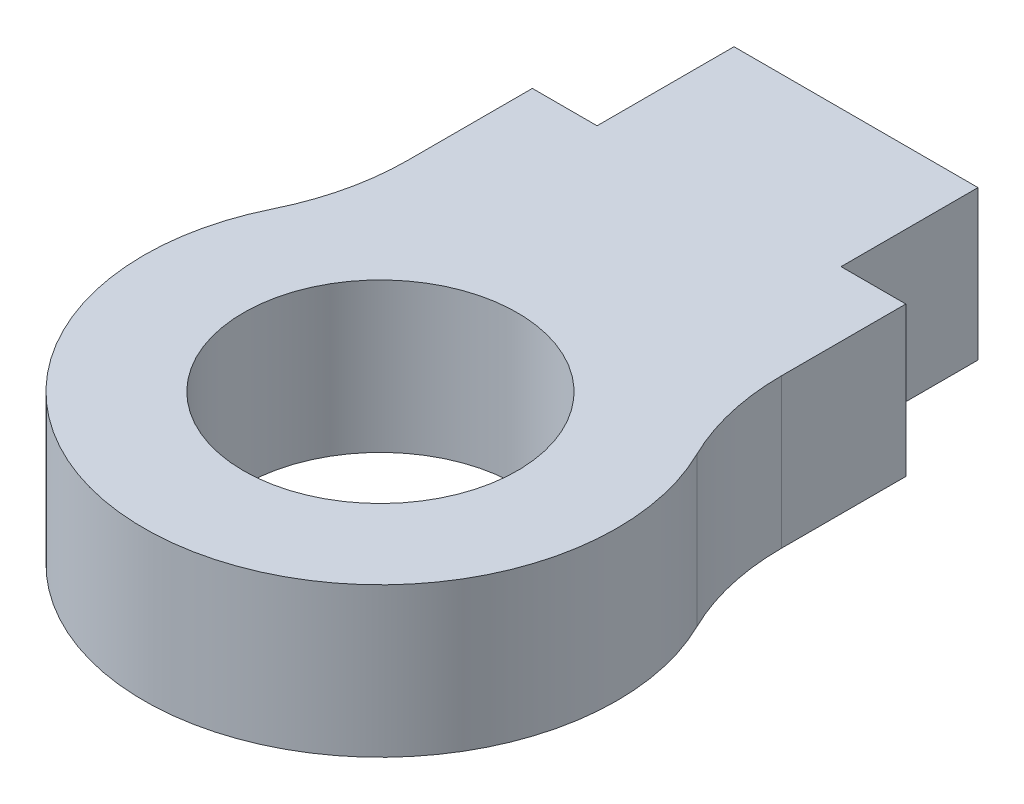
ISO-10303-21;
HEADER;
FILE_DESCRIPTION(('STEP AP214'),'2;1');
FILE_NAME('part.step','',(''),(''),'','','');
FILE_SCHEMA(('AUTOMOTIVE_DESIGN { 1 0 10303 214 1 1 1 1 }'));
ENDSEC;
DATA;
#1=APPLICATION_CONTEXT('core data for automotive mechanical design processes');
#2=APPLICATION_PROTOCOL_DEFINITION('international standard','automotive_design',2000,#1);
#3=PRODUCT_CONTEXT('',#1,'mechanical');
#4=PRODUCT('Part','Part','',(#3));
#5=PRODUCT_RELATED_PRODUCT_CATEGORY('part','',(#4));
#6=PRODUCT_DEFINITION_FORMATION('','',#4);
#7=PRODUCT_DEFINITION_CONTEXT('part definition',#1,'design');
#8=PRODUCT_DEFINITION('design','',#6,#7);
#9=PRODUCT_DEFINITION_SHAPE('','',#8);
#10=(LENGTH_UNIT() NAMED_UNIT(*) SI_UNIT(.MILLI.,.METRE.));
#11=(NAMED_UNIT(*) PLANE_ANGLE_UNIT() SI_UNIT($,.RADIAN.));
#12=(NAMED_UNIT(*) SI_UNIT($,.STERADIAN.) SOLID_ANGLE_UNIT());
#13=UNCERTAINTY_MEASURE_WITH_UNIT(LENGTH_MEASURE(1.E-05),#10,'distance_accuracy_value','');
#14=(GEOMETRIC_REPRESENTATION_CONTEXT(3) GLOBAL_UNCERTAINTY_ASSIGNED_CONTEXT((#13)) GLOBAL_UNIT_ASSIGNED_CONTEXT((#10,
#11,#12)) REPRESENTATION_CONTEXT('',''));
#15=CARTESIAN_POINT('',(0.,0.,0.));
#16=DIRECTION('',(0.,0.,1.));
#17=DIRECTION('',(1.,0.,0.));
#18=AXIS2_PLACEMENT_3D('',#15,#16,#17);
#19=CARTESIAN_POINT('',(-17.5,6.,-8.60232526704262));
#20=DIRECTION('',(0.,1.,0.));
#21=DIRECTION('',(0.,0.,1.));
#22=AXIS2_PLACEMENT_3D('',#19,#20,#21);
#23=PLANE('',#22);
#24=CARTESIAN_POINT('',(-17.5,6.,-8.60232526704262));
#25=DIRECTION('',(0.,-1.,0.));
#26=DIRECTION('',(0.,0.,1.));
#27=AXIS2_PLACEMENT_3D('',#24,#25,#26);
#28=CIRCLE('',#27,10.);
#29=CARTESIAN_POINT('',(-7.5,6.,-8.60232526704262));
#30=VERTEX_POINT('',#29);
#31=CARTESIAN_POINT('',(-8.52564102564102,6.,-4.19087641214897));
#32=VERTEX_POINT('',#31);
#33=EDGE_CURVE('E160',#30,#32,#28,.T.);
#34=ORIENTED_EDGE('',*,*,#33,.T.);
#35=CARTESIAN_POINT('',(0.,6.,0.));
#36=DIRECTION('',(0.,1.,0.));
#37=DIRECTION('',(0.,0.,1.));
#38=AXIS2_PLACEMENT_3D('',#35,#36,#37);
#39=CIRCLE('',#38,9.5);
#40=CARTESIAN_POINT('',(8.52564102564102,6.,-4.19087641214897));
#41=VERTEX_POINT('',#40);
#42=EDGE_CURVE('E98',#32,#41,#39,.T.);
#43=ORIENTED_EDGE('',*,*,#42,.T.);
#44=CARTESIAN_POINT('',(17.5,6.,-8.60232526704262));
#45=DIRECTION('',(0.,-1.,0.));
#46=DIRECTION('',(0.,0.,1.));
#47=AXIS2_PLACEMENT_3D('',#44,#45,#46);
#48=CIRCLE('',#47,10.);
#49=CARTESIAN_POINT('',(7.5,6.,-8.60232526704262));
#50=VERTEX_POINT('',#49);
#51=EDGE_CURVE('E181',#41,#50,#48,.T.);
#52=ORIENTED_EDGE('',*,*,#51,.T.);
#53=DIRECTION('',(0.,0.,-1.));
#54=VECTOR('',#53,1.);
#55=CARTESIAN_POINT('',(7.5,6.,-8.60232526704262));
#56=LINE('',#55,#54);
#57=CARTESIAN_POINT('',(7.5,6.,-13.6023252670426));
#58=VERTEX_POINT('',#57);
#59=EDGE_CURVE('E200',#50,#58,#56,.T.);
#60=ORIENTED_EDGE('',*,*,#59,.T.);
#61=DIRECTION('',(-1.,0.,0.));
#62=VECTOR('',#61,1.);
#63=CARTESIAN_POINT('',(7.5,6.,-13.6023252670426));
#64=LINE('',#63,#62);
#65=CARTESIAN_POINT('',(4.9,6.,-13.6023252670426));
#66=VERTEX_POINT('',#65);
#67=EDGE_CURVE('E197',#58,#66,#64,.T.);
#68=ORIENTED_EDGE('',*,*,#67,.T.);
#69=DIRECTION('',(0.,0.,-1.));
#70=VECTOR('',#69,1.);
#71=CARTESIAN_POINT('',(4.9,6.,-13.6023252670426));
#72=LINE('',#71,#70);
#73=CARTESIAN_POINT('',(4.9,6.,-19.1023252670426));
#74=VERTEX_POINT('',#73);
#75=EDGE_CURVE('E199',#66,#74,#72,.T.);
#76=ORIENTED_EDGE('',*,*,#75,.T.);
#77=DIRECTION('',(-1.,0.,0.));
#78=VECTOR('',#77,1.);
#79=CARTESIAN_POINT('',(4.9,6.,-19.1023252670426));
#80=LINE('',#79,#78);
#81=CARTESIAN_POINT('',(-4.9,6.,-19.1023252670426));
#82=VERTEX_POINT('',#81);
#83=EDGE_CURVE('E123',#74,#82,#80,.T.);
#84=ORIENTED_EDGE('',*,*,#83,.T.);
#85=DIRECTION('',(0.,0.,1.));
#86=VECTOR('',#85,1.);
#87=CARTESIAN_POINT('',(-4.9,6.,-19.1023252670426));
#88=LINE('',#87,#86);
#89=CARTESIAN_POINT('',(-4.9,6.,-13.6023252670426));
#90=VERTEX_POINT('',#89);
#91=EDGE_CURVE('E117',#82,#90,#88,.T.);
#92=ORIENTED_EDGE('',*,*,#91,.T.);
#93=DIRECTION('',(-1.,0.,0.));
#94=VECTOR('',#93,1.);
#95=CARTESIAN_POINT('',(-4.9,6.,-13.6023252670426));
#96=LINE('',#95,#94);
#97=CARTESIAN_POINT('',(-7.5,6.,-13.6023252670426));
#98=VERTEX_POINT('',#97);
#99=EDGE_CURVE('E121',#90,#98,#96,.T.);
#100=ORIENTED_EDGE('',*,*,#99,.T.);
#101=DIRECTION('',(0.,0.,1.));
#102=VECTOR('',#101,1.);
#103=CARTESIAN_POINT('',(-7.5,6.,-13.6023252670426));
#104=LINE('',#103,#102);
#105=EDGE_CURVE('E49',#98,#30,#104,.T.);
#106=ORIENTED_EDGE('',*,*,#105,.T.);
#107=EDGE_LOOP('',(#34,#43,#52,#60,#68,#76,#84,#92,#100,#106));
#108=FACE_BOUND('',#107,.T.);
#109=CARTESIAN_POINT('',(0.,6.,0.));
#110=DIRECTION('',(0.,1.,0.));
#111=DIRECTION('',(0.,0.,1.));
#112=AXIS2_PLACEMENT_3D('',#109,#110,#111);
#113=CIRCLE('',#112,5.5);
#114=CARTESIAN_POINT('',(0.,6.,5.5));
#115=VERTEX_POINT('',#114);
#116=EDGE_CURVE('E145',#115,#115,#113,.T.);
#117=ORIENTED_EDGE('',*,*,#116,.F.);
#118=EDGE_LOOP('',(#117));
#119=FACE_BOUND('',#118,.T.);
#120=ADVANCED_FACE('F32',(#108,#119),#23,.T.);
#121=CARTESIAN_POINT('',(-17.5,0.,-8.60232526704262));
#122=DIRECTION('',(0.,1.,0.));
#123=DIRECTION('',(0.,0.,1.));
#124=AXIS2_PLACEMENT_3D('',#121,#122,#123);
#125=PLANE('',#124);
#126=CARTESIAN_POINT('',(-17.5,0.,-8.60232526704262));
#127=DIRECTION('',(0.,-1.,0.));
#128=DIRECTION('',(0.,0.,1.));
#129=AXIS2_PLACEMENT_3D('',#126,#127,#128);
#130=CIRCLE('',#129,10.);
#131=CARTESIAN_POINT('',(-7.5,0.,-8.60232526704262));
#132=VERTEX_POINT('',#131);
#133=CARTESIAN_POINT('',(-8.52564102564102,0.,-4.19087641214897));
#134=VERTEX_POINT('',#133);
#135=EDGE_CURVE('E141',#132,#134,#130,.T.);
#136=ORIENTED_EDGE('',*,*,#135,.F.);
#137=DIRECTION('',(0.,0.,1.));
#138=VECTOR('',#137,1.);
#139=CARTESIAN_POINT('',(-7.5,0.,-13.6023252670426));
#140=LINE('',#139,#138);
#141=CARTESIAN_POINT('',(-7.5,0.,-13.6023252670426));
#142=VERTEX_POINT('',#141);
#143=EDGE_CURVE('E90',#142,#132,#140,.T.);
#144=ORIENTED_EDGE('',*,*,#143,.F.);
#145=DIRECTION('',(-1.,0.,0.));
#146=VECTOR('',#145,1.);
#147=CARTESIAN_POINT('',(-4.9,0.,-13.6023252670426));
#148=LINE('',#147,#146);
#149=CARTESIAN_POINT('',(-4.9,0.,-13.6023252670426));
#150=VERTEX_POINT('',#149);
#151=EDGE_CURVE('E84',#150,#142,#148,.T.);
#152=ORIENTED_EDGE('',*,*,#151,.F.);
#153=DIRECTION('',(0.,0.,1.));
#154=VECTOR('',#153,1.);
#155=CARTESIAN_POINT('',(-4.9,0.,-19.1023252670426));
#156=LINE('',#155,#154);
#157=CARTESIAN_POINT('',(-4.9,0.,-19.1023252670426));
#158=VERTEX_POINT('',#157);
#159=EDGE_CURVE('E131',#158,#150,#156,.T.);
#160=ORIENTED_EDGE('',*,*,#159,.F.);
#161=DIRECTION('',(-1.,0.,0.));
#162=VECTOR('',#161,1.);
#163=CARTESIAN_POINT('',(4.9,0.,-19.1023252670426));
#164=LINE('',#163,#162);
#165=CARTESIAN_POINT('',(4.9,0.,-19.1023252670426));
#166=VERTEX_POINT('',#165);
#167=EDGE_CURVE('E155',#166,#158,#164,.T.);
#168=ORIENTED_EDGE('',*,*,#167,.F.);
#169=DIRECTION('',(0.,0.,-1.));
#170=VECTOR('',#169,1.);
#171=CARTESIAN_POINT('',(4.9,0.,-13.6023252670426));
#172=LINE('',#171,#170);
#173=CARTESIAN_POINT('',(4.9,0.,-13.6023252670426));
#174=VERTEX_POINT('',#173);
#175=EDGE_CURVE('E153',#174,#166,#172,.T.);
#176=ORIENTED_EDGE('',*,*,#175,.F.);
#177=DIRECTION('',(-1.,0.,0.));
#178=VECTOR('',#177,1.);
#179=CARTESIAN_POINT('',(7.5,0.,-13.6023252670426));
#180=LINE('',#179,#178);
#181=CARTESIAN_POINT('',(7.5,0.,-13.6023252670426));
#182=VERTEX_POINT('',#181);
#183=EDGE_CURVE('E151',#182,#174,#180,.T.);
#184=ORIENTED_EDGE('',*,*,#183,.F.);
#185=DIRECTION('',(0.,0.,-1.));
#186=VECTOR('',#185,1.);
#187=CARTESIAN_POINT('',(7.5,0.,-8.60232526704262));
#188=LINE('',#187,#186);
#189=CARTESIAN_POINT('',(7.5,0.,-8.60232526704262));
#190=VERTEX_POINT('',#189);
#191=EDGE_CURVE('E149',#190,#182,#188,.T.);
#192=ORIENTED_EDGE('',*,*,#191,.F.);
#193=CARTESIAN_POINT('',(17.5,0.,-8.60232526704262));
#194=DIRECTION('',(0.,-1.,0.));
#195=DIRECTION('',(0.,0.,1.));
#196=AXIS2_PLACEMENT_3D('',#193,#194,#195);
#197=CIRCLE('',#196,10.);
#198=CARTESIAN_POINT('',(8.52564102564102,0.,-4.19087641214897));
#199=VERTEX_POINT('',#198);
#200=EDGE_CURVE('E147',#199,#190,#197,.T.);
#201=ORIENTED_EDGE('',*,*,#200,.F.);
#202=CARTESIAN_POINT('',(0.,0.,0.));
#203=DIRECTION('',(0.,1.,0.));
#204=DIRECTION('',(0.,0.,1.));
#205=AXIS2_PLACEMENT_3D('',#202,#203,#204);
#206=CIRCLE('',#205,9.5);
#207=EDGE_CURVE('E144',#134,#199,#206,.T.);
#208=ORIENTED_EDGE('',*,*,#207,.F.);
#209=EDGE_LOOP('',(#136,#144,#152,#160,#168,#176,#184,#192,#201,#208));
#210=FACE_BOUND('',#209,.T.);
#211=CARTESIAN_POINT('',(0.,0.,0.));
#212=DIRECTION('',(0.,1.,0.));
#213=DIRECTION('',(0.,0.,1.));
#214=AXIS2_PLACEMENT_3D('',#211,#212,#213);
#215=CIRCLE('',#214,5.5);
#216=CARTESIAN_POINT('',(0.,0.,5.5));
#217=VERTEX_POINT('',#216);
#218=EDGE_CURVE('E208',#217,#217,#215,.T.);
#219=ORIENTED_EDGE('',*,*,#218,.T.);
#220=EDGE_LOOP('',(#219));
#221=FACE_BOUND('',#220,.T.);
#222=ADVANCED_FACE('F185',(#210,#221),#125,.F.);
#223=CARTESIAN_POINT('',(-17.5,6.,-8.60232526704262));
#224=DIRECTION('',(0.,-1.,0.));
#225=DIRECTION('',(0.,0.,-1.));
#226=AXIS2_PLACEMENT_3D('',#223,#224,#225);
#227=CYLINDRICAL_SURFACE('',#226,10.);
#228=ORIENTED_EDGE('',*,*,#135,.T.);
#229=DIRECTION('',(0.,-1.,0.));
#230=VECTOR('',#229,1.);
#231=CARTESIAN_POINT('',(-8.52564102564102,6.,-4.19087641214897));
#232=LINE('',#231,#230);
#233=EDGE_CURVE('E11',#32,#134,#232,.T.);
#234=ORIENTED_EDGE('',*,*,#233,.F.);
#235=ORIENTED_EDGE('',*,*,#33,.F.);
#236=DIRECTION('',(0.,-1.,0.));
#237=VECTOR('',#236,1.);
#238=CARTESIAN_POINT('',(-7.5,6.,-8.60232526704262));
#239=LINE('',#238,#237);
#240=EDGE_CURVE('E137',#30,#132,#239,.T.);
#241=ORIENTED_EDGE('',*,*,#240,.T.);
#242=EDGE_LOOP('',(#228,#234,#235,#241));
#243=FACE_BOUND('',#242,.T.);
#244=ADVANCED_FACE('F34',(#243),#227,.F.);
#245=CARTESIAN_POINT('',(0.,6.,0.));
#246=DIRECTION('',(0.,-1.,0.));
#247=DIRECTION('',(0.,0.,-1.));
#248=AXIS2_PLACEMENT_3D('',#245,#246,#247);
#249=CYLINDRICAL_SURFACE('',#248,9.5);
#250=ORIENTED_EDGE('',*,*,#207,.T.);
#251=DIRECTION('',(0.,-1.,0.));
#252=VECTOR('',#251,1.);
#253=CARTESIAN_POINT('',(8.52564102564102,6.,-4.19087641214897));
#254=LINE('',#253,#252);
#255=EDGE_CURVE('E41',#41,#199,#254,.T.);
#256=ORIENTED_EDGE('',*,*,#255,.F.);
#257=ORIENTED_EDGE('',*,*,#42,.F.);
#258=ORIENTED_EDGE('',*,*,#233,.T.);
#259=EDGE_LOOP('',(#250,#256,#257,#258));
#260=FACE_BOUND('',#259,.T.);
#261=ADVANCED_FACE('F244',(#260),#249,.T.);
#262=CARTESIAN_POINT('',(17.5,6.,-8.60232526704262));
#263=DIRECTION('',(0.,-1.,0.));
#264=DIRECTION('',(0.,0.,-1.));
#265=AXIS2_PLACEMENT_3D('',#262,#263,#264);
#266=CYLINDRICAL_SURFACE('',#265,10.);
#267=ORIENTED_EDGE('',*,*,#200,.T.);
#268=DIRECTION('',(0.,-1.,0.));
#269=VECTOR('',#268,1.);
#270=CARTESIAN_POINT('',(7.5,6.,-8.60232526704262));
#271=LINE('',#270,#269);
#272=EDGE_CURVE('E173',#50,#190,#271,.T.);
#273=ORIENTED_EDGE('',*,*,#272,.F.);
#274=ORIENTED_EDGE('',*,*,#51,.F.);
#275=ORIENTED_EDGE('',*,*,#255,.T.);
#276=EDGE_LOOP('',(#267,#273,#274,#275));
#277=FACE_BOUND('',#276,.T.);
#278=ADVANCED_FACE('F179',(#277),#266,.F.);
#279=CARTESIAN_POINT('',(7.5,6.,-8.60232526704262));
#280=DIRECTION('',(-1.,0.,0.));
#281=DIRECTION('',(0.,0.,1.));
#282=AXIS2_PLACEMENT_3D('',#279,#280,#281);
#283=PLANE('',#282);
#284=ORIENTED_EDGE('',*,*,#191,.T.);
#285=DIRECTION('',(0.,-1.,0.));
#286=VECTOR('',#285,1.);
#287=CARTESIAN_POINT('',(7.5,6.,-13.6023252670426));
#288=LINE('',#287,#286);
#289=EDGE_CURVE('E170',#58,#182,#288,.T.);
#290=ORIENTED_EDGE('',*,*,#289,.F.);
#291=ORIENTED_EDGE('',*,*,#59,.F.);
#292=ORIENTED_EDGE('',*,*,#272,.T.);
#293=EDGE_LOOP('',(#284,#290,#291,#292));
#294=FACE_BOUND('',#293,.T.);
#295=ADVANCED_FACE('F191',(#294),#283,.F.);
#296=CARTESIAN_POINT('',(7.5,6.,-13.6023252670426));
#297=DIRECTION('',(0.,0.,1.));
#298=DIRECTION('',(1.,0.,0.));
#299=AXIS2_PLACEMENT_3D('',#296,#297,#298);
#300=PLANE('',#299);
#301=ORIENTED_EDGE('',*,*,#183,.T.);
#302=DIRECTION('',(0.,-1.,0.));
#303=VECTOR('',#302,1.);
#304=CARTESIAN_POINT('',(4.9,6.,-13.6023252670426));
#305=LINE('',#304,#303);
#306=EDGE_CURVE('E167',#66,#174,#305,.T.);
#307=ORIENTED_EDGE('',*,*,#306,.F.);
#308=ORIENTED_EDGE('',*,*,#67,.F.);
#309=ORIENTED_EDGE('',*,*,#289,.T.);
#310=EDGE_LOOP('',(#301,#307,#308,#309));
#311=FACE_BOUND('',#310,.T.);
#312=ADVANCED_FACE('F195',(#311),#300,.F.);
#313=CARTESIAN_POINT('',(4.9,6.,-13.6023252670426));
#314=DIRECTION('',(-1.,0.,0.));
#315=DIRECTION('',(0.,0.,1.));
#316=AXIS2_PLACEMENT_3D('',#313,#314,#315);
#317=PLANE('',#316);
#318=ORIENTED_EDGE('',*,*,#175,.T.);
#319=DIRECTION('',(0.,-1.,0.));
#320=VECTOR('',#319,1.);
#321=CARTESIAN_POINT('',(4.9,6.,-19.1023252670426));
#322=LINE('',#321,#320);
#323=EDGE_CURVE('E164',#74,#166,#322,.T.);
#324=ORIENTED_EDGE('',*,*,#323,.F.);
#325=ORIENTED_EDGE('',*,*,#75,.F.);
#326=ORIENTED_EDGE('',*,*,#306,.T.);
#327=EDGE_LOOP('',(#318,#324,#325,#326));
#328=FACE_BOUND('',#327,.T.);
#329=ADVANCED_FACE('F234',(#328),#317,.F.);
#330=CARTESIAN_POINT('',(4.9,6.,-19.1023252670426));
#331=DIRECTION('',(0.,0.,1.));
#332=DIRECTION('',(1.,0.,0.));
#333=AXIS2_PLACEMENT_3D('',#330,#331,#332);
#334=PLANE('',#333);
#335=ORIENTED_EDGE('',*,*,#167,.T.);
#336=DIRECTION('',(0.,-1.,0.));
#337=VECTOR('',#336,1.);
#338=CARTESIAN_POINT('',(-4.9,6.,-19.1023252670426));
#339=LINE('',#338,#337);
#340=EDGE_CURVE('E132',#82,#158,#339,.T.);
#341=ORIENTED_EDGE('',*,*,#340,.F.);
#342=ORIENTED_EDGE('',*,*,#83,.F.);
#343=ORIENTED_EDGE('',*,*,#323,.T.);
#344=EDGE_LOOP('',(#335,#341,#342,#343));
#345=FACE_BOUND('',#344,.T.);
#346=ADVANCED_FACE('F231',(#345),#334,.F.);
#347=CARTESIAN_POINT('',(-4.9,6.,-19.1023252670426));
#348=DIRECTION('',(1.,0.,0.));
#349=DIRECTION('',(0.,0.,-1.));
#350=AXIS2_PLACEMENT_3D('',#347,#348,#349);
#351=PLANE('',#350);
#352=ORIENTED_EDGE('',*,*,#159,.T.);
#353=DIRECTION('',(0.,-1.,0.));
#354=VECTOR('',#353,1.);
#355=CARTESIAN_POINT('',(-4.9,6.,-13.6023252670426));
#356=LINE('',#355,#354);
#357=EDGE_CURVE('E128',#90,#150,#356,.T.);
#358=ORIENTED_EDGE('',*,*,#357,.F.);
#359=ORIENTED_EDGE('',*,*,#91,.F.);
#360=ORIENTED_EDGE('',*,*,#340,.T.);
#361=EDGE_LOOP('',(#352,#358,#359,#360));
#362=FACE_BOUND('',#361,.T.);
#363=ADVANCED_FACE('F129',(#362),#351,.F.);
#364=CARTESIAN_POINT('',(-4.9,6.,-13.6023252670426));
#365=DIRECTION('',(0.,0.,1.));
#366=DIRECTION('',(1.,0.,0.));
#367=AXIS2_PLACEMENT_3D('',#364,#365,#366);
#368=PLANE('',#367);
#369=ORIENTED_EDGE('',*,*,#151,.T.);
#370=DIRECTION('',(0.,-1.,0.));
#371=VECTOR('',#370,1.);
#372=CARTESIAN_POINT('',(-7.5,6.,-13.6023252670426));
#373=LINE('',#372,#371);
#374=EDGE_CURVE('E133',#98,#142,#373,.T.);
#375=ORIENTED_EDGE('',*,*,#374,.F.);
#376=ORIENTED_EDGE('',*,*,#99,.F.);
#377=ORIENTED_EDGE('',*,*,#357,.T.);
#378=EDGE_LOOP('',(#369,#375,#376,#377));
#379=FACE_BOUND('',#378,.T.);
#380=ADVANCED_FACE('F135',(#379),#368,.F.);
#381=CARTESIAN_POINT('',(-7.5,6.,-13.6023252670426));
#382=DIRECTION('',(1.,0.,0.));
#383=DIRECTION('',(0.,0.,-1.));
#384=AXIS2_PLACEMENT_3D('',#381,#382,#383);
#385=PLANE('',#384);
#386=ORIENTED_EDGE('',*,*,#143,.T.);
#387=ORIENTED_EDGE('',*,*,#240,.F.);
#388=ORIENTED_EDGE('',*,*,#105,.F.);
#389=ORIENTED_EDGE('',*,*,#374,.T.);
#390=EDGE_LOOP('',(#386,#387,#388,#389));
#391=FACE_BOUND('',#390,.T.);
#392=ADVANCED_FACE('F224',(#391),#385,.F.);
#393=CARTESIAN_POINT('',(0.,6.,0.));
#394=DIRECTION('',(0.,-1.,0.));
#395=DIRECTION('',(0.,0.,-1.));
#396=AXIS2_PLACEMENT_3D('',#393,#394,#395);
#397=CYLINDRICAL_SURFACE('',#396,5.5);
#398=ORIENTED_EDGE('',*,*,#116,.T.);
#399=EDGE_LOOP('',(#398));
#400=FACE_BOUND('',#399,.T.);
#401=ORIENTED_EDGE('',*,*,#218,.F.);
#402=EDGE_LOOP('',(#401));
#403=FACE_BOUND('',#402,.T.);
#404=ADVANCED_FACE('F214',(#400,#403),#397,.F.);
#405=CLOSED_SHELL('',(#120,#222,#244,#261,#278,#295,#312,#329,#346,#363,#380,#392,#404));
#406=MANIFOLD_SOLID_BREP('B2',#405);
#407=ADVANCED_BREP_SHAPE_REPRESENTATION('',(#18,#406),#14);
#408=SHAPE_DEFINITION_REPRESENTATION(#9,#407);
ENDSEC;
END-ISO-10303-21;
